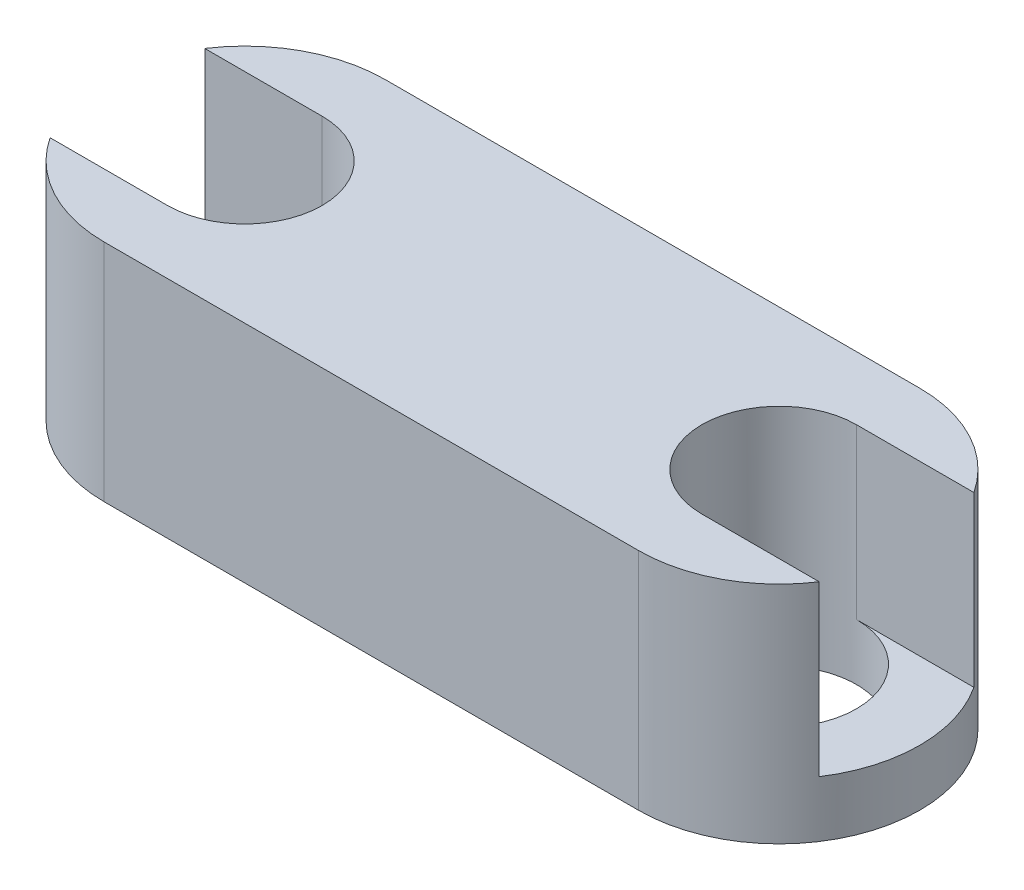
ISO-10303-21;
HEADER;
FILE_DESCRIPTION(('STEP AP214'),'2;1');
FILE_NAME('part.step','',(''),(''),'','','');
FILE_SCHEMA(('AUTOMOTIVE_DESIGN { 1 0 10303 214 1 1 1 1 }'));
ENDSEC;
DATA;
#1=APPLICATION_CONTEXT('core data for automotive mechanical design processes');
#2=APPLICATION_PROTOCOL_DEFINITION('international standard','automotive_design',2000,#1);
#3=PRODUCT_CONTEXT('',#1,'mechanical');
#4=PRODUCT('Part','Part','',(#3));
#5=PRODUCT_RELATED_PRODUCT_CATEGORY('part','',(#4));
#6=PRODUCT_DEFINITION_FORMATION('','',#4);
#7=PRODUCT_DEFINITION_CONTEXT('part definition',#1,'design');
#8=PRODUCT_DEFINITION('design','',#6,#7);
#9=PRODUCT_DEFINITION_SHAPE('','',#8);
#10=(LENGTH_UNIT() NAMED_UNIT(*) SI_UNIT(.MILLI.,.METRE.));
#11=(NAMED_UNIT(*) PLANE_ANGLE_UNIT() SI_UNIT($,.RADIAN.));
#12=(NAMED_UNIT(*) SI_UNIT($,.STERADIAN.) SOLID_ANGLE_UNIT());
#13=UNCERTAINTY_MEASURE_WITH_UNIT(LENGTH_MEASURE(1.E-05),#10,'distance_accuracy_value','');
#14=(GEOMETRIC_REPRESENTATION_CONTEXT(3) GLOBAL_UNCERTAINTY_ASSIGNED_CONTEXT((#13)) GLOBAL_UNIT_ASSIGNED_CONTEXT((#10,
#11,#12)) REPRESENTATION_CONTEXT('',''));
#15=CARTESIAN_POINT('',(0.,0.,0.));
#16=DIRECTION('',(0.,0.,1.));
#17=DIRECTION('',(1.,0.,0.));
#18=AXIS2_PLACEMENT_3D('',#15,#16,#17);
#19=CARTESIAN_POINT('',(-7.71252727608147,8.,-1.5));
#20=DIRECTION('',(0.,1.,0.));
#21=DIRECTION('',(0.,0.,1.));
#22=AXIS2_PLACEMENT_3D('',#19,#20,#21);
#23=PLANE('',#22);
#24=DIRECTION('',(1.,0.,0.));
#25=VECTOR('',#24,1.);
#26=CARTESIAN_POINT('',(-7.71252727608147,8.,1.25));
#27=LINE('',#26,#25);
#28=CARTESIAN_POINT('',(-11.888350548204,8.,1.25));
#29=VERTEX_POINT('',#28);
#30=CARTESIAN_POINT('',(-7.71252727608147,8.,1.25));
#31=VERTEX_POINT('',#30);
#32=EDGE_CURVE('E144',#29,#31,#27,.T.);
#33=ORIENTED_EDGE('',*,*,#32,.F.);
#34=CARTESIAN_POINT('',(-7.71252727608147,8.,-1.5));
#35=DIRECTION('',(0.,1.,0.));
#36=DIRECTION('',(0.,0.,1.));
#37=AXIS2_PLACEMENT_3D('',#34,#35,#36);
#38=CIRCLE('',#37,5.);
#39=CARTESIAN_POINT('',(-7.71252727608147,8.,3.5));
#40=VERTEX_POINT('',#39);
#41=EDGE_CURVE('E218',#29,#40,#38,.T.);
#42=ORIENTED_EDGE('',*,*,#41,.T.);
#43=DIRECTION('',(1.,0.,0.));
#44=VECTOR('',#43,1.);
#45=CARTESIAN_POINT('',(-7.71252727608147,8.,3.5));
#46=LINE('',#45,#44);
#47=CARTESIAN_POINT('',(11.2874727239185,8.,3.5));
#48=VERTEX_POINT('',#47);
#49=EDGE_CURVE('E217',#40,#48,#46,.T.);
#50=ORIENTED_EDGE('',*,*,#49,.T.);
#51=CARTESIAN_POINT('',(11.2874727239185,8.,-1.5));
#52=DIRECTION('',(0.,1.,0.));
#53=DIRECTION('',(0.,0.,1.));
#54=AXIS2_PLACEMENT_3D('',#51,#52,#53);
#55=CIRCLE('',#54,5.);
#56=CARTESIAN_POINT('',(15.4632959960411,8.,1.25));
#57=VERTEX_POINT('',#56);
#58=EDGE_CURVE('E222',#48,#57,#55,.T.);
#59=ORIENTED_EDGE('',*,*,#58,.T.);
#60=DIRECTION('',(1.,0.,0.));
#61=VECTOR('',#60,1.);
#62=CARTESIAN_POINT('',(11.2874727239185,8.,1.25));
#63=LINE('',#62,#61);
#64=CARTESIAN_POINT('',(11.2874727239185,8.,1.25));
#65=VERTEX_POINT('',#64);
#66=EDGE_CURVE('E169',#65,#57,#63,.T.);
#67=ORIENTED_EDGE('',*,*,#66,.F.);
#68=CARTESIAN_POINT('',(11.2874727239185,8.,-1.5));
#69=DIRECTION('',(0.,1.,0.));
#70=DIRECTION('',(0.,0.,1.));
#71=AXIS2_PLACEMENT_3D('',#68,#69,#70);
#72=CIRCLE('',#71,2.75);
#73=CARTESIAN_POINT('',(11.2874727239185,8.,-4.25));
#74=VERTEX_POINT('',#73);
#75=EDGE_CURVE('E199',#74,#65,#72,.T.);
#76=ORIENTED_EDGE('',*,*,#75,.F.);
#77=DIRECTION('',(-1.,0.,0.));
#78=VECTOR('',#77,1.);
#79=CARTESIAN_POINT('',(11.2874727239185,8.,-4.25));
#80=LINE('',#79,#78);
#81=CARTESIAN_POINT('',(15.4632959960411,8.,-4.25));
#82=VERTEX_POINT('',#81);
#83=EDGE_CURVE('E165',#82,#74,#80,.T.);
#84=ORIENTED_EDGE('',*,*,#83,.F.);
#85=CARTESIAN_POINT('',(11.2874727239185,8.,-6.5));
#86=VERTEX_POINT('',#85);
#87=EDGE_CURVE('E221',#82,#86,#55,.T.);
#88=ORIENTED_EDGE('',*,*,#87,.T.);
#89=DIRECTION('',(-1.,0.,0.));
#90=VECTOR('',#89,1.);
#91=CARTESIAN_POINT('',(-7.71252727608147,8.,-6.5));
#92=LINE('',#91,#90);
#93=CARTESIAN_POINT('',(-7.71252727608147,8.,-6.5));
#94=VERTEX_POINT('',#93);
#95=EDGE_CURVE('E226',#86,#94,#92,.T.);
#96=ORIENTED_EDGE('',*,*,#95,.T.);
#97=CARTESIAN_POINT('',(-11.888350548204,8.,-4.25));
#98=VERTEX_POINT('',#97);
#99=EDGE_CURVE('E213',#94,#98,#38,.T.);
#100=ORIENTED_EDGE('',*,*,#99,.T.);
#101=DIRECTION('',(-1.,0.,0.));
#102=VECTOR('',#101,1.);
#103=CARTESIAN_POINT('',(-7.71252727608147,8.,-4.25));
#104=LINE('',#103,#102);
#105=CARTESIAN_POINT('',(-7.71252727608147,8.,-4.25));
#106=VERTEX_POINT('',#105);
#107=EDGE_CURVE('E176',#106,#98,#104,.T.);
#108=ORIENTED_EDGE('',*,*,#107,.F.);
#109=CARTESIAN_POINT('',(-7.71252727608147,8.,-1.5));
#110=DIRECTION('',(0.,1.,0.));
#111=DIRECTION('',(0.,0.,1.));
#112=AXIS2_PLACEMENT_3D('',#109,#110,#111);
#113=CIRCLE('',#112,2.75);
#114=EDGE_CURVE('E150',#31,#106,#113,.T.);
#115=ORIENTED_EDGE('',*,*,#114,.F.);
#116=EDGE_LOOP('',(#33,#42,#50,#59,#67,#76,#84,#88,#96,#100,#108,#115));
#117=FACE_BOUND('',#116,.T.);
#118=ADVANCED_FACE('F39',(#117),#23,.T.);
#119=CARTESIAN_POINT('',(-7.71252727608147,0.,-1.5));
#120=DIRECTION('',(0.,1.,0.));
#121=DIRECTION('',(0.,0.,1.));
#122=AXIS2_PLACEMENT_3D('',#119,#120,#121);
#123=PLANE('',#122);
#124=CARTESIAN_POINT('',(-7.71252727608147,0.,-1.5));
#125=DIRECTION('',(0.,1.,0.));
#126=DIRECTION('',(0.,0.,1.));
#127=AXIS2_PLACEMENT_3D('',#124,#125,#126);
#128=CIRCLE('',#127,5.);
#129=CARTESIAN_POINT('',(-7.71252727608147,0.,-6.5));
#130=VERTEX_POINT('',#129);
#131=CARTESIAN_POINT('',(-7.71252727608147,0.,3.5));
#132=VERTEX_POINT('',#131);
#133=EDGE_CURVE('E209',#130,#132,#128,.T.);
#134=ORIENTED_EDGE('',*,*,#133,.F.);
#135=DIRECTION('',(-1.,0.,0.));
#136=VECTOR('',#135,1.);
#137=CARTESIAN_POINT('',(-7.71252727608147,0.,-6.5));
#138=LINE('',#137,#136);
#139=CARTESIAN_POINT('',(11.2874727239185,0.,-6.5));
#140=VERTEX_POINT('',#139);
#141=EDGE_CURVE('E239',#140,#130,#138,.T.);
#142=ORIENTED_EDGE('',*,*,#141,.F.);
#143=CARTESIAN_POINT('',(11.2874727239185,0.,-1.5));
#144=DIRECTION('',(0.,1.,0.));
#145=DIRECTION('',(0.,0.,1.));
#146=AXIS2_PLACEMENT_3D('',#143,#144,#145);
#147=CIRCLE('',#146,5.);
#148=CARTESIAN_POINT('',(11.2874727239185,0.,3.5));
#149=VERTEX_POINT('',#148);
#150=EDGE_CURVE('E236',#149,#140,#147,.T.);
#151=ORIENTED_EDGE('',*,*,#150,.F.);
#152=DIRECTION('',(1.,0.,0.));
#153=VECTOR('',#152,1.);
#154=CARTESIAN_POINT('',(-7.71252727608147,0.,3.5));
#155=LINE('',#154,#153);
#156=EDGE_CURVE('E233',#132,#149,#155,.T.);
#157=ORIENTED_EDGE('',*,*,#156,.F.);
#158=EDGE_LOOP('',(#134,#142,#151,#157));
#159=FACE_BOUND('',#158,.T.);
#160=CARTESIAN_POINT('',(-7.71252727608147,0.,-1.5));
#161=DIRECTION('',(0.,1.,0.));
#162=DIRECTION('',(0.,0.,1.));
#163=AXIS2_PLACEMENT_3D('',#160,#161,#162);
#164=CIRCLE('',#163,2.75);
#165=CARTESIAN_POINT('',(-7.71252727608147,0.,1.25));
#166=VERTEX_POINT('',#165);
#167=EDGE_CURVE('E203',#166,#166,#164,.T.);
#168=ORIENTED_EDGE('',*,*,#167,.T.);
#169=EDGE_LOOP('',(#168));
#170=FACE_BOUND('',#169,.T.);
#171=CARTESIAN_POINT('',(11.2874727239185,0.,-1.5));
#172=DIRECTION('',(0.,1.,0.));
#173=DIRECTION('',(0.,0.,1.));
#174=AXIS2_PLACEMENT_3D('',#171,#172,#173);
#175=CIRCLE('',#174,2.75);
#176=CARTESIAN_POINT('',(11.2874727239185,0.,1.25));
#177=VERTEX_POINT('',#176);
#178=EDGE_CURVE('E198',#177,#177,#175,.T.);
#179=ORIENTED_EDGE('',*,*,#178,.T.);
#180=EDGE_LOOP('',(#179));
#181=FACE_BOUND('',#180,.T.);
#182=ADVANCED_FACE('F287',(#159,#170,#181),#123,.F.);
#183=CARTESIAN_POINT('',(-7.71252727608147,8.,-1.5));
#184=DIRECTION('',(0.,-1.,0.));
#185=DIRECTION('',(0.,0.,-1.));
#186=AXIS2_PLACEMENT_3D('',#183,#184,#185);
#187=CYLINDRICAL_SURFACE('',#186,5.);
#188=ORIENTED_EDGE('',*,*,#41,.F.);
#189=DIRECTION('',(0.,-1.,0.));
#190=VECTOR('',#189,1.);
#191=CARTESIAN_POINT('',(-11.888350548204,8.,1.25));
#192=LINE('',#191,#190);
#193=CARTESIAN_POINT('',(-11.888350548204,2.,1.25));
#194=VERTEX_POINT('',#193);
#195=EDGE_CURVE('E194',#29,#194,#192,.T.);
#196=ORIENTED_EDGE('',*,*,#195,.T.);
#197=CARTESIAN_POINT('',(-7.71252727608147,2.,-1.5));
#198=DIRECTION('',(0.,-1.,0.));
#199=DIRECTION('',(0.,0.,-1.));
#200=AXIS2_PLACEMENT_3D('',#197,#198,#199);
#201=CIRCLE('',#200,5.);
#202=CARTESIAN_POINT('',(-11.888350548204,2.,-4.25));
#203=VERTEX_POINT('',#202);
#204=EDGE_CURVE('E189',#194,#203,#201,.T.);
#205=ORIENTED_EDGE('',*,*,#204,.T.);
#206=DIRECTION('',(0.,-1.,0.));
#207=VECTOR('',#206,1.);
#208=CARTESIAN_POINT('',(-11.888350548204,8.,-4.25));
#209=LINE('',#208,#207);
#210=EDGE_CURVE('E142',#203,#98,#209,.F.);
#211=ORIENTED_EDGE('',*,*,#210,.T.);
#212=ORIENTED_EDGE('',*,*,#99,.F.);
#213=DIRECTION('',(0.,-1.,0.));
#214=VECTOR('',#213,1.);
#215=CARTESIAN_POINT('',(-7.71252727608147,8.,-6.5));
#216=LINE('',#215,#214);
#217=EDGE_CURVE('E229',#94,#130,#216,.T.);
#218=ORIENTED_EDGE('',*,*,#217,.T.);
#219=ORIENTED_EDGE('',*,*,#133,.T.);
#220=DIRECTION('',(0.,-1.,0.));
#221=VECTOR('',#220,1.);
#222=CARTESIAN_POINT('',(-7.71252727608147,8.,3.5));
#223=LINE('',#222,#221);
#224=EDGE_CURVE('E253',#40,#132,#223,.T.);
#225=ORIENTED_EDGE('',*,*,#224,.F.);
#226=EDGE_LOOP('',(#188,#196,#205,#211,#212,#218,#219,#225));
#227=FACE_BOUND('',#226,.T.);
#228=ADVANCED_FACE('F41',(#227),#187,.T.);
#229=CARTESIAN_POINT('',(-7.71252727608147,8.,3.5));
#230=DIRECTION('',(0.,0.,-1.));
#231=DIRECTION('',(-1.,0.,0.));
#232=AXIS2_PLACEMENT_3D('',#229,#230,#231);
#233=PLANE('',#232);
#234=ORIENTED_EDGE('',*,*,#156,.T.);
#235=DIRECTION('',(0.,-1.,0.));
#236=VECTOR('',#235,1.);
#237=CARTESIAN_POINT('',(11.2874727239185,8.,3.5));
#238=LINE('',#237,#236);
#239=EDGE_CURVE('E249',#48,#149,#238,.T.);
#240=ORIENTED_EDGE('',*,*,#239,.F.);
#241=ORIENTED_EDGE('',*,*,#49,.F.);
#242=ORIENTED_EDGE('',*,*,#224,.T.);
#243=EDGE_LOOP('',(#234,#240,#241,#242));
#244=FACE_BOUND('',#243,.T.);
#245=ADVANCED_FACE('F281',(#244),#233,.F.);
#246=CARTESIAN_POINT('',(11.2874727239185,8.,-1.5));
#247=DIRECTION('',(0.,-1.,0.));
#248=DIRECTION('',(0.,0.,-1.));
#249=AXIS2_PLACEMENT_3D('',#246,#247,#248);
#250=CYLINDRICAL_SURFACE('',#249,5.);
#251=ORIENTED_EDGE('',*,*,#87,.F.);
#252=DIRECTION('',(0.,-1.,0.));
#253=VECTOR('',#252,1.);
#254=CARTESIAN_POINT('',(15.4632959960411,8.,-4.25));
#255=LINE('',#254,#253);
#256=CARTESIAN_POINT('',(15.4632959960411,2.,-4.25));
#257=VERTEX_POINT('',#256);
#258=EDGE_CURVE('E185',#82,#257,#255,.T.);
#259=ORIENTED_EDGE('',*,*,#258,.T.);
#260=CARTESIAN_POINT('',(11.2874727239185,2.,-1.5));
#261=DIRECTION('',(0.,1.,0.));
#262=DIRECTION('',(0.,0.,1.));
#263=AXIS2_PLACEMENT_3D('',#260,#261,#262);
#264=CIRCLE('',#263,5.);
#265=CARTESIAN_POINT('',(15.4632959960411,2.,1.25));
#266=VERTEX_POINT('',#265);
#267=EDGE_CURVE('E155',#266,#257,#264,.T.);
#268=ORIENTED_EDGE('',*,*,#267,.F.);
#269=DIRECTION('',(0.,-1.,0.));
#270=VECTOR('',#269,1.);
#271=CARTESIAN_POINT('',(15.4632959960411,8.,1.25));
#272=LINE('',#271,#270);
#273=EDGE_CURVE('E181',#266,#57,#272,.F.);
#274=ORIENTED_EDGE('',*,*,#273,.T.);
#275=ORIENTED_EDGE('',*,*,#58,.F.);
#276=ORIENTED_EDGE('',*,*,#239,.T.);
#277=ORIENTED_EDGE('',*,*,#150,.T.);
#278=DIRECTION('',(0.,-1.,0.));
#279=VECTOR('',#278,1.);
#280=CARTESIAN_POINT('',(11.2874727239185,8.,-6.5));
#281=LINE('',#280,#279);
#282=EDGE_CURVE('E245',#86,#140,#281,.T.);
#283=ORIENTED_EDGE('',*,*,#282,.F.);
#284=EDGE_LOOP('',(#251,#259,#268,#274,#275,#276,#277,#283));
#285=FACE_BOUND('',#284,.T.);
#286=ADVANCED_FACE('F273',(#285),#250,.T.);
#287=CARTESIAN_POINT('',(-7.71252727608147,8.,-6.5));
#288=DIRECTION('',(0.,0.,1.));
#289=DIRECTION('',(1.,0.,0.));
#290=AXIS2_PLACEMENT_3D('',#287,#288,#289);
#291=PLANE('',#290);
#292=ORIENTED_EDGE('',*,*,#141,.T.);
#293=ORIENTED_EDGE('',*,*,#217,.F.);
#294=ORIENTED_EDGE('',*,*,#95,.F.);
#295=ORIENTED_EDGE('',*,*,#282,.T.);
#296=EDGE_LOOP('',(#292,#293,#294,#295));
#297=FACE_BOUND('',#296,.T.);
#298=ADVANCED_FACE('F291',(#297),#291,.F.);
#299=CARTESIAN_POINT('',(-7.71252727608147,8.,-1.5));
#300=DIRECTION('',(0.,-1.,0.));
#301=DIRECTION('',(0.,0.,-1.));
#302=AXIS2_PLACEMENT_3D('',#299,#300,#301);
#303=CYLINDRICAL_SURFACE('',#302,2.75);
#304=DIRECTION('',(0.,1.,0.));
#305=VECTOR('',#304,1.);
#306=CARTESIAN_POINT('',(-7.71252727608147,2.,1.25));
#307=LINE('',#306,#305);
#308=CARTESIAN_POINT('',(-7.71252727608147,2.,1.25));
#309=VERTEX_POINT('',#308);
#310=EDGE_CURVE('E55',#309,#31,#307,.T.);
#311=ORIENTED_EDGE('',*,*,#310,.T.);
#312=ORIENTED_EDGE('',*,*,#114,.T.);
#313=DIRECTION('',(0.,1.,0.));
#314=VECTOR('',#313,1.);
#315=CARTESIAN_POINT('',(-7.71252727608147,2.,-4.25));
#316=LINE('',#315,#314);
#317=CARTESIAN_POINT('',(-7.71252727608147,2.,-4.25));
#318=VERTEX_POINT('',#317);
#319=EDGE_CURVE('E139',#318,#106,#316,.T.);
#320=ORIENTED_EDGE('',*,*,#319,.F.);
#321=CARTESIAN_POINT('',(-7.71252727608147,2.,-1.5));
#322=DIRECTION('',(0.,-1.,0.));
#323=DIRECTION('',(0.,0.,-1.));
#324=AXIS2_PLACEMENT_3D('',#321,#322,#323);
#325=CIRCLE('',#324,2.75);
#326=EDGE_CURVE('E11',#309,#318,#325,.T.);
#327=ORIENTED_EDGE('',*,*,#326,.F.);
#328=EDGE_LOOP('',(#311,#312,#320,#327));
#329=FACE_BOUND('',#328,.T.);
#330=ORIENTED_EDGE('',*,*,#167,.F.);
#331=EDGE_LOOP('',(#330));
#332=FACE_BOUND('',#331,.T.);
#333=ADVANCED_FACE('F147',(#329,#332),#303,.F.);
#334=CARTESIAN_POINT('',(11.2874727239185,8.,-1.5));
#335=DIRECTION('',(0.,-1.,0.));
#336=DIRECTION('',(0.,0.,-1.));
#337=AXIS2_PLACEMENT_3D('',#334,#335,#336);
#338=CYLINDRICAL_SURFACE('',#337,2.75);
#339=DIRECTION('',(0.,1.,0.));
#340=VECTOR('',#339,1.);
#341=CARTESIAN_POINT('',(11.2874727239185,2.,-4.25));
#342=LINE('',#341,#340);
#343=CARTESIAN_POINT('',(11.2874727239185,2.,-4.25));
#344=VERTEX_POINT('',#343);
#345=EDGE_CURVE('E63',#344,#74,#342,.T.);
#346=ORIENTED_EDGE('',*,*,#345,.T.);
#347=ORIENTED_EDGE('',*,*,#75,.T.);
#348=DIRECTION('',(0.,1.,0.));
#349=VECTOR('',#348,1.);
#350=CARTESIAN_POINT('',(11.2874727239185,2.,1.25));
#351=LINE('',#350,#349);
#352=CARTESIAN_POINT('',(11.2874727239185,2.,1.25));
#353=VERTEX_POINT('',#352);
#354=EDGE_CURVE('E168',#353,#65,#351,.T.);
#355=ORIENTED_EDGE('',*,*,#354,.F.);
#356=CARTESIAN_POINT('',(11.2874727239185,2.,-1.5));
#357=DIRECTION('',(0.,1.,0.));
#358=DIRECTION('',(0.,0.,1.));
#359=AXIS2_PLACEMENT_3D('',#356,#357,#358);
#360=CIRCLE('',#359,2.75);
#361=EDGE_CURVE('E48',#353,#344,#360,.T.);
#362=ORIENTED_EDGE('',*,*,#361,.T.);
#363=EDGE_LOOP('',(#346,#347,#355,#362));
#364=FACE_BOUND('',#363,.T.);
#365=ORIENTED_EDGE('',*,*,#178,.F.);
#366=EDGE_LOOP('',(#365));
#367=FACE_BOUND('',#366,.T.);
#368=ADVANCED_FACE('F260',(#364,#367),#338,.F.);
#369=CARTESIAN_POINT('',(11.2874727239185,2.,-4.25));
#370=DIRECTION('',(0.,0.,-1.));
#371=DIRECTION('',(-1.,0.,0.));
#372=AXIS2_PLACEMENT_3D('',#369,#370,#371);
#373=PLANE('',#372);
#374=ORIENTED_EDGE('',*,*,#83,.T.);
#375=ORIENTED_EDGE('',*,*,#345,.F.);
#376=DIRECTION('',(-1.,0.,0.));
#377=VECTOR('',#376,1.);
#378=CARTESIAN_POINT('',(11.2874727239185,2.,-4.25));
#379=LINE('',#378,#377);
#380=EDGE_CURVE('E164',#257,#344,#379,.T.);
#381=ORIENTED_EDGE('',*,*,#380,.F.);
#382=ORIENTED_EDGE('',*,*,#258,.F.);
#383=EDGE_LOOP('',(#374,#375,#381,#382));
#384=FACE_BOUND('',#383,.T.);
#385=ADVANCED_FACE('F298',(#384),#373,.F.);
#386=CARTESIAN_POINT('',(11.2874727239185,2.,1.25));
#387=DIRECTION('',(0.,0.,1.));
#388=DIRECTION('',(1.,0.,0.));
#389=AXIS2_PLACEMENT_3D('',#386,#387,#388);
#390=PLANE('',#389);
#391=DIRECTION('',(1.,0.,0.));
#392=VECTOR('',#391,1.);
#393=CARTESIAN_POINT('',(11.2874727239185,2.,1.25));
#394=LINE('',#393,#392);
#395=EDGE_CURVE('E160',#353,#266,#394,.T.);
#396=ORIENTED_EDGE('',*,*,#395,.F.);
#397=ORIENTED_EDGE('',*,*,#354,.T.);
#398=ORIENTED_EDGE('',*,*,#66,.T.);
#399=ORIENTED_EDGE('',*,*,#273,.F.);
#400=EDGE_LOOP('',(#396,#397,#398,#399));
#401=FACE_BOUND('',#400,.T.);
#402=ADVANCED_FACE('F268',(#401),#390,.F.);
#403=CARTESIAN_POINT('',(0.,2.,0.));
#404=DIRECTION('',(0.,1.,0.));
#405=DIRECTION('',(0.,0.,1.));
#406=AXIS2_PLACEMENT_3D('',#403,#404,#405);
#407=PLANE('',#406);
#408=ORIENTED_EDGE('',*,*,#267,.T.);
#409=ORIENTED_EDGE('',*,*,#380,.T.);
#410=ORIENTED_EDGE('',*,*,#361,.F.);
#411=ORIENTED_EDGE('',*,*,#395,.T.);
#412=EDGE_LOOP('',(#408,#409,#410,#411));
#413=FACE_BOUND('',#412,.T.);
#414=ADVANCED_FACE('F265',(#413),#407,.T.);
#415=CARTESIAN_POINT('',(-7.71252727608147,2.,1.25));
#416=DIRECTION('',(0.,0.,1.));
#417=DIRECTION('',(1.,0.,0.));
#418=AXIS2_PLACEMENT_3D('',#415,#416,#417);
#419=PLANE('',#418);
#420=ORIENTED_EDGE('',*,*,#32,.T.);
#421=ORIENTED_EDGE('',*,*,#310,.F.);
#422=DIRECTION('',(1.,0.,0.));
#423=VECTOR('',#422,1.);
#424=CARTESIAN_POINT('',(-7.71252727608147,2.,1.25));
#425=LINE('',#424,#423);
#426=EDGE_CURVE('E134',#194,#309,#425,.T.);
#427=ORIENTED_EDGE('',*,*,#426,.F.);
#428=ORIENTED_EDGE('',*,*,#195,.F.);
#429=EDGE_LOOP('',(#420,#421,#427,#428));
#430=FACE_BOUND('',#429,.T.);
#431=ADVANCED_FACE('F376',(#430),#419,.F.);
#432=CARTESIAN_POINT('',(-7.71252727608147,2.,-4.25));
#433=DIRECTION('',(0.,0.,-1.));
#434=DIRECTION('',(-1.,0.,0.));
#435=AXIS2_PLACEMENT_3D('',#432,#433,#434);
#436=PLANE('',#435);
#437=DIRECTION('',(-1.,0.,0.));
#438=VECTOR('',#437,1.);
#439=CARTESIAN_POINT('',(-7.71252727608147,2.,-4.25));
#440=LINE('',#439,#438);
#441=EDGE_CURVE('E132',#318,#203,#440,.T.);
#442=ORIENTED_EDGE('',*,*,#441,.F.);
#443=ORIENTED_EDGE('',*,*,#319,.T.);
#444=ORIENTED_EDGE('',*,*,#107,.T.);
#445=ORIENTED_EDGE('',*,*,#210,.F.);
#446=EDGE_LOOP('',(#442,#443,#444,#445));
#447=FACE_BOUND('',#446,.T.);
#448=ADVANCED_FACE('F138',(#447),#436,.F.);
#449=CARTESIAN_POINT('',(0.,2.,0.));
#450=DIRECTION('',(0.,-1.,0.));
#451=DIRECTION('',(0.,0.,-1.));
#452=AXIS2_PLACEMENT_3D('',#449,#450,#451);
#453=PLANE('',#452);
#454=ORIENTED_EDGE('',*,*,#426,.T.);
#455=ORIENTED_EDGE('',*,*,#326,.T.);
#456=ORIENTED_EDGE('',*,*,#441,.T.);
#457=ORIENTED_EDGE('',*,*,#204,.F.);
#458=EDGE_LOOP('',(#454,#455,#456,#457));
#459=FACE_BOUND('',#458,.T.);
#460=ADVANCED_FACE('F131',(#459),#453,.F.);
#461=CLOSED_SHELL('',(#118,#182,#228,#245,#286,#298,#333,#368,#385,#402,#414,#431,#448,#460));
#462=MANIFOLD_SOLID_BREP('B2',#461);
#463=ADVANCED_BREP_SHAPE_REPRESENTATION('',(#18,#462),#14);
#464=SHAPE_DEFINITION_REPRESENTATION(#9,#463);
ENDSEC;
END-ISO-10303-21;
